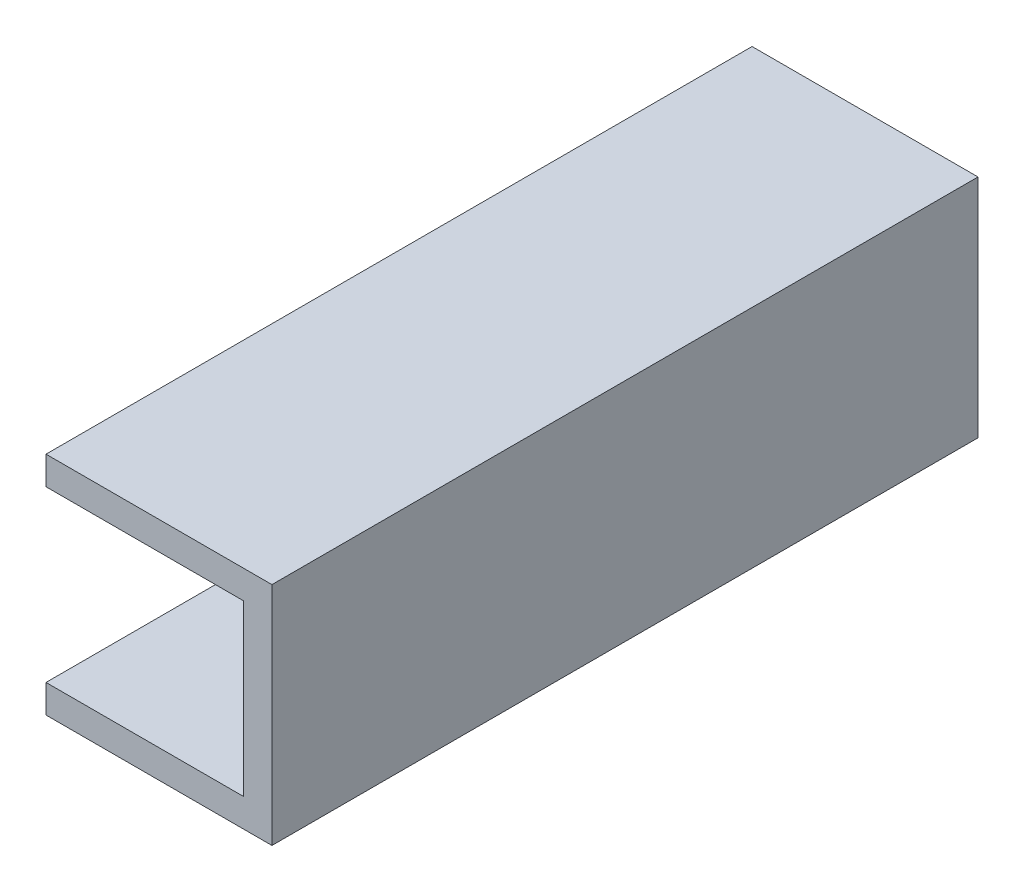
ISO-10303-21;
HEADER;
FILE_DESCRIPTION(('STEP AP214'),'2;1');
FILE_NAME('part.step','',(''),(''),'','','');
FILE_SCHEMA(('AUTOMOTIVE_DESIGN { 1 0 10303 214 1 1 1 1 }'));
ENDSEC;
DATA;
#1=APPLICATION_CONTEXT('core data for automotive mechanical design processes');
#2=APPLICATION_PROTOCOL_DEFINITION('international standard','automotive_design',2000,#1);
#3=PRODUCT_CONTEXT('',#1,'mechanical');
#4=PRODUCT('Part','Part','',(#3));
#5=PRODUCT_RELATED_PRODUCT_CATEGORY('part','',(#4));
#6=PRODUCT_DEFINITION_FORMATION('','',#4);
#7=PRODUCT_DEFINITION_CONTEXT('part definition',#1,'design');
#8=PRODUCT_DEFINITION('design','',#6,#7);
#9=PRODUCT_DEFINITION_SHAPE('','',#8);
#10=(LENGTH_UNIT() NAMED_UNIT(*) SI_UNIT(.MILLI.,.METRE.));
#11=(NAMED_UNIT(*) PLANE_ANGLE_UNIT() SI_UNIT($,.RADIAN.));
#12=(NAMED_UNIT(*) SI_UNIT($,.STERADIAN.) SOLID_ANGLE_UNIT());
#13=UNCERTAINTY_MEASURE_WITH_UNIT(LENGTH_MEASURE(1.E-05),#10,'distance_accuracy_value','');
#14=(GEOMETRIC_REPRESENTATION_CONTEXT(3) GLOBAL_UNCERTAINTY_ASSIGNED_CONTEXT((#13)) GLOBAL_UNIT_ASSIGNED_CONTEXT((#10,
#11,#12)) REPRESENTATION_CONTEXT('',''));
#15=CARTESIAN_POINT('',(0.,0.,0.));
#16=DIRECTION('',(0.,0.,1.));
#17=DIRECTION('',(1.,0.,0.));
#18=AXIS2_PLACEMENT_3D('',#15,#16,#17);
#19=CARTESIAN_POINT('',(0.8,0.2,-0.625));
#20=DIRECTION('',(0.,1.,0.));
#21=DIRECTION('',(-1.,0.,0.));
#22=AXIS2_PLACEMENT_3D('',#19,#20,#21);
#23=PLANE('',#22);
#24=DIRECTION('',(1.,0.,0.));
#25=VECTOR('',#24,1.);
#26=CARTESIAN_POINT('',(0.838043478261,0.2,0.625));
#27=LINE('',#26,#25);
#28=CARTESIAN_POINT('',(1.,0.2,0.625));
#29=VERTEX_POINT('',#28);
#30=CARTESIAN_POINT('',(0.6,0.2,0.625));
#31=VERTEX_POINT('',#30);
#32=EDGE_CURVE('E121',#29,#31,#27,.F.);
#33=ORIENTED_EDGE('',*,*,#32,.F.);
#34=DIRECTION('',(0.,0.,-1.));
#35=VECTOR('',#34,1.);
#36=CARTESIAN_POINT('',(1.,0.2,-0.625));
#37=LINE('',#36,#35);
#38=CARTESIAN_POINT('',(1.,0.2,-0.625));
#39=VERTEX_POINT('',#38);
#40=EDGE_CURVE('E129',#39,#29,#37,.F.);
#41=ORIENTED_EDGE('',*,*,#40,.F.);
#42=DIRECTION('',(1.,0.,0.));
#43=VECTOR('',#42,1.);
#44=CARTESIAN_POINT('',(0.838043478261,0.2,-0.625));
#45=LINE('',#44,#43);
#46=CARTESIAN_POINT('',(0.6,0.2,-0.625));
#47=VERTEX_POINT('',#46);
#48=EDGE_CURVE('E134',#39,#47,#45,.F.);
#49=ORIENTED_EDGE('',*,*,#48,.T.);
#50=DIRECTION('',(0.,0.,1.));
#51=VECTOR('',#50,1.);
#52=CARTESIAN_POINT('',(0.6,0.2,-0.625));
#53=LINE('',#52,#51);
#54=EDGE_CURVE('E20',#31,#47,#53,.F.);
#55=ORIENTED_EDGE('',*,*,#54,.F.);
#56=EDGE_LOOP('',(#33,#41,#49,#55));
#57=FACE_BOUND('',#56,.T.);
#58=ADVANCED_FACE('F17',(#57),#23,.T.);
#59=CARTESIAN_POINT('',(0.6,0.175,-0.625));
#60=DIRECTION('',(-1.,0.,0.));
#61=DIRECTION('',(0.,0.,1.));
#62=AXIS2_PLACEMENT_3D('',#59,#60,#61);
#63=PLANE('',#62);
#64=DIRECTION('',(0.,1.,0.));
#65=VECTOR('',#64,1.);
#66=CARTESIAN_POINT('',(0.6,0.,0.625));
#67=LINE('',#66,#65);
#68=CARTESIAN_POINT('',(0.6,0.15,0.625));
#69=VERTEX_POINT('',#68);
#70=EDGE_CURVE('E119',#31,#69,#67,.F.);
#71=ORIENTED_EDGE('',*,*,#70,.F.);
#72=ORIENTED_EDGE('',*,*,#54,.T.);
#73=DIRECTION('',(0.,1.,0.));
#74=VECTOR('',#73,1.);
#75=CARTESIAN_POINT('',(0.6,0.,-0.625));
#76=LINE('',#75,#74);
#77=CARTESIAN_POINT('',(0.6,0.15,-0.625));
#78=VERTEX_POINT('',#77);
#79=EDGE_CURVE('E81',#47,#78,#76,.F.);
#80=ORIENTED_EDGE('',*,*,#79,.T.);
#81=DIRECTION('',(0.,0.,1.));
#82=VECTOR('',#81,1.);
#83=CARTESIAN_POINT('',(0.6,0.15,-0.625));
#84=LINE('',#83,#82);
#85=EDGE_CURVE('E84',#69,#78,#84,.F.);
#86=ORIENTED_EDGE('',*,*,#85,.F.);
#87=EDGE_LOOP('',(#71,#72,#80,#86));
#88=FACE_BOUND('',#87,.T.);
#89=ADVANCED_FACE('F83',(#88),#63,.T.);
#90=CARTESIAN_POINT('',(0.775,0.15,-0.625));
#91=DIRECTION('',(0.,-1.,0.));
#92=DIRECTION('',(1.,0.,0.));
#93=AXIS2_PLACEMENT_3D('',#90,#91,#92);
#94=PLANE('',#93);
#95=DIRECTION('',(1.,0.,0.));
#96=VECTOR('',#95,1.);
#97=CARTESIAN_POINT('',(0.838043478261,0.15,0.625));
#98=LINE('',#97,#96);
#99=CARTESIAN_POINT('',(0.95,0.15,0.625));
#100=VERTEX_POINT('',#99);
#101=EDGE_CURVE('E95',#69,#100,#98,.T.);
#102=ORIENTED_EDGE('',*,*,#101,.F.);
#103=ORIENTED_EDGE('',*,*,#85,.T.);
#104=DIRECTION('',(1.,0.,0.));
#105=VECTOR('',#104,1.);
#106=CARTESIAN_POINT('',(0.838043478261,0.15,-0.625));
#107=LINE('',#106,#105);
#108=CARTESIAN_POINT('',(0.95,0.15,-0.625));
#109=VERTEX_POINT('',#108);
#110=EDGE_CURVE('E88',#78,#109,#107,.T.);
#111=ORIENTED_EDGE('',*,*,#110,.T.);
#112=DIRECTION('',(0.,0.,1.));
#113=VECTOR('',#112,1.);
#114=CARTESIAN_POINT('',(0.95,0.15,-0.625));
#115=LINE('',#114,#113);
#116=EDGE_CURVE('E97',#100,#109,#115,.F.);
#117=ORIENTED_EDGE('',*,*,#116,.F.);
#118=EDGE_LOOP('',(#102,#103,#111,#117));
#119=FACE_BOUND('',#118,.T.);
#120=ADVANCED_FACE('F92',(#119),#94,.T.);
#121=CARTESIAN_POINT('',(0.95,0.,-0.625));
#122=DIRECTION('',(-1.,0.,0.));
#123=DIRECTION('',(0.,0.,1.));
#124=AXIS2_PLACEMENT_3D('',#121,#122,#123);
#125=PLANE('',#124);
#126=DIRECTION('',(0.,1.,0.));
#127=VECTOR('',#126,1.);
#128=CARTESIAN_POINT('',(0.95,0.,0.625));
#129=LINE('',#128,#127);
#130=CARTESIAN_POINT('',(0.95,-0.15,0.625));
#131=VERTEX_POINT('',#130);
#132=EDGE_CURVE('E113',#100,#131,#129,.F.);
#133=ORIENTED_EDGE('',*,*,#132,.F.);
#134=ORIENTED_EDGE('',*,*,#116,.T.);
#135=DIRECTION('',(0.,1.,0.));
#136=VECTOR('',#135,1.);
#137=CARTESIAN_POINT('',(0.95,0.,-0.625));
#138=LINE('',#137,#136);
#139=CARTESIAN_POINT('',(0.95,-0.15,-0.625));
#140=VERTEX_POINT('',#139);
#141=EDGE_CURVE('E101',#109,#140,#138,.F.);
#142=ORIENTED_EDGE('',*,*,#141,.T.);
#143=DIRECTION('',(0.,0.,1.));
#144=VECTOR('',#143,1.);
#145=CARTESIAN_POINT('',(0.95,-0.15,-0.625));
#146=LINE('',#145,#144);
#147=EDGE_CURVE('E89',#131,#140,#146,.F.);
#148=ORIENTED_EDGE('',*,*,#147,.F.);
#149=EDGE_LOOP('',(#133,#134,#142,#148));
#150=FACE_BOUND('',#149,.T.);
#151=ADVANCED_FACE('F111',(#150),#125,.T.);
#152=CARTESIAN_POINT('',(0.775,-0.15,-0.625));
#153=DIRECTION('',(0.,1.,0.));
#154=DIRECTION('',(-1.,0.,0.));
#155=AXIS2_PLACEMENT_3D('',#152,#153,#154);
#156=PLANE('',#155);
#157=DIRECTION('',(1.,0.,0.));
#158=VECTOR('',#157,1.);
#159=CARTESIAN_POINT('',(0.838043478261,-0.15,0.625));
#160=LINE('',#159,#158);
#161=CARTESIAN_POINT('',(0.6,-0.15,0.625));
#162=VERTEX_POINT('',#161);
#163=EDGE_CURVE('E115',#131,#162,#160,.F.);
#164=ORIENTED_EDGE('',*,*,#163,.F.);
#165=ORIENTED_EDGE('',*,*,#147,.T.);
#166=DIRECTION('',(1.,0.,0.));
#167=VECTOR('',#166,1.);
#168=CARTESIAN_POINT('',(0.838043478261,-0.15,-0.625));
#169=LINE('',#168,#167);
#170=CARTESIAN_POINT('',(0.6,-0.15,-0.625));
#171=VERTEX_POINT('',#170);
#172=EDGE_CURVE('E103',#140,#171,#169,.F.);
#173=ORIENTED_EDGE('',*,*,#172,.T.);
#174=DIRECTION('',(0.,0.,1.));
#175=VECTOR('',#174,1.);
#176=CARTESIAN_POINT('',(0.6,-0.15,-0.625));
#177=LINE('',#176,#175);
#178=EDGE_CURVE('E140',#162,#171,#177,.F.);
#179=ORIENTED_EDGE('',*,*,#178,.F.);
#180=EDGE_LOOP('',(#164,#165,#173,#179));
#181=FACE_BOUND('',#180,.T.);
#182=ADVANCED_FACE('F138',(#181),#156,.T.);
#183=CARTESIAN_POINT('',(0.838043478261,0.,-0.625));
#184=DIRECTION('',(0.,0.,1.));
#185=DIRECTION('',(1.,0.,0.));
#186=AXIS2_PLACEMENT_3D('',#183,#184,#185);
#187=PLANE('',#186);
#188=DIRECTION('',(0.,1.,0.));
#189=VECTOR('',#188,1.);
#190=CARTESIAN_POINT('',(1.,0.,-0.625));
#191=LINE('',#190,#189);
#192=CARTESIAN_POINT('',(1.,-0.2,-0.625));
#193=VERTEX_POINT('',#192);
#194=EDGE_CURVE('E131',#193,#39,#191,.T.);
#195=ORIENTED_EDGE('',*,*,#194,.F.);
#196=DIRECTION('',(1.,0.,0.));
#197=VECTOR('',#196,1.);
#198=CARTESIAN_POINT('',(0.8,-0.2,-0.625));
#199=LINE('',#198,#197);
#200=CARTESIAN_POINT('',(0.6,-0.2,-0.625));
#201=VERTEX_POINT('',#200);
#202=EDGE_CURVE('E144',#201,#193,#199,.T.);
#203=ORIENTED_EDGE('',*,*,#202,.F.);
#204=DIRECTION('',(0.,1.,0.));
#205=VECTOR('',#204,1.);
#206=CARTESIAN_POINT('',(0.6,-0.175,-0.625));
#207=LINE('',#206,#205);
#208=EDGE_CURVE('E142',#171,#201,#207,.F.);
#209=ORIENTED_EDGE('',*,*,#208,.F.);
#210=ORIENTED_EDGE('',*,*,#172,.F.);
#211=ORIENTED_EDGE('',*,*,#141,.F.);
#212=ORIENTED_EDGE('',*,*,#110,.F.);
#213=ORIENTED_EDGE('',*,*,#79,.F.);
#214=ORIENTED_EDGE('',*,*,#48,.F.);
#215=EDGE_LOOP('',(#195,#203,#209,#210,#211,#212,#213,#214));
#216=FACE_BOUND('',#215,.T.);
#217=ADVANCED_FACE('F99',(#216),#187,.F.);
#218=CARTESIAN_POINT('',(1.,0.,-0.625));
#219=DIRECTION('',(1.,0.,0.));
#220=DIRECTION('',(0.,0.,-1.));
#221=AXIS2_PLACEMENT_3D('',#218,#219,#220);
#222=PLANE('',#221);
#223=DIRECTION('',(0.,1.,0.));
#224=VECTOR('',#223,1.);
#225=CARTESIAN_POINT('',(1.,0.,0.625));
#226=LINE('',#225,#224);
#227=CARTESIAN_POINT('',(1.,-0.2,0.625));
#228=VERTEX_POINT('',#227);
#229=EDGE_CURVE('E126',#228,#29,#226,.T.);
#230=ORIENTED_EDGE('',*,*,#229,.F.);
#231=DIRECTION('',(0.,0.,1.));
#232=VECTOR('',#231,1.);
#233=CARTESIAN_POINT('',(1.,-0.2,-0.625));
#234=LINE('',#233,#232);
#235=EDGE_CURVE('E149',#193,#228,#234,.T.);
#236=ORIENTED_EDGE('',*,*,#235,.F.);
#237=ORIENTED_EDGE('',*,*,#194,.T.);
#238=ORIENTED_EDGE('',*,*,#40,.T.);
#239=EDGE_LOOP('',(#230,#236,#237,#238));
#240=FACE_BOUND('',#239,.T.);
#241=ADVANCED_FACE('F161',(#240),#222,.T.);
#242=CARTESIAN_POINT('',(0.838043478261,0.,0.625));
#243=DIRECTION('',(0.,0.,1.));
#244=DIRECTION('',(1.,0.,0.));
#245=AXIS2_PLACEMENT_3D('',#242,#243,#244);
#246=PLANE('',#245);
#247=ORIENTED_EDGE('',*,*,#163,.T.);
#248=DIRECTION('',(0.,1.,0.));
#249=VECTOR('',#248,1.);
#250=CARTESIAN_POINT('',(0.6,-0.175,0.625));
#251=LINE('',#250,#249);
#252=CARTESIAN_POINT('',(0.6,-0.2,0.625));
#253=VERTEX_POINT('',#252);
#254=EDGE_CURVE('E35',#253,#162,#251,.T.);
#255=ORIENTED_EDGE('',*,*,#254,.F.);
#256=DIRECTION('',(1.,0.,0.));
#257=VECTOR('',#256,1.);
#258=CARTESIAN_POINT('',(0.8,-0.2,0.625));
#259=LINE('',#258,#257);
#260=EDGE_CURVE('E26',#228,#253,#259,.F.);
#261=ORIENTED_EDGE('',*,*,#260,.F.);
#262=ORIENTED_EDGE('',*,*,#229,.T.);
#263=ORIENTED_EDGE('',*,*,#32,.T.);
#264=ORIENTED_EDGE('',*,*,#70,.T.);
#265=ORIENTED_EDGE('',*,*,#101,.T.);
#266=ORIENTED_EDGE('',*,*,#132,.T.);
#267=EDGE_LOOP('',(#247,#255,#261,#262,#263,#264,#265,#266));
#268=FACE_BOUND('',#267,.T.);
#269=ADVANCED_FACE('F117',(#268),#246,.T.);
#270=CARTESIAN_POINT('',(0.6,-0.175,-0.625));
#271=DIRECTION('',(-1.,0.,0.));
#272=DIRECTION('',(0.,0.,1.));
#273=AXIS2_PLACEMENT_3D('',#270,#271,#272);
#274=PLANE('',#273);
#275=ORIENTED_EDGE('',*,*,#254,.T.);
#276=ORIENTED_EDGE('',*,*,#178,.T.);
#277=ORIENTED_EDGE('',*,*,#208,.T.);
#278=DIRECTION('',(0.,0.,1.));
#279=VECTOR('',#278,1.);
#280=CARTESIAN_POINT('',(0.6,-0.2,-0.625));
#281=LINE('',#280,#279);
#282=EDGE_CURVE('E11',#253,#201,#281,.F.);
#283=ORIENTED_EDGE('',*,*,#282,.F.);
#284=EDGE_LOOP('',(#275,#276,#277,#283));
#285=FACE_BOUND('',#284,.T.);
#286=ADVANCED_FACE('F147',(#285),#274,.T.);
#287=CARTESIAN_POINT('',(0.8,-0.2,-0.625));
#288=DIRECTION('',(0.,-1.,0.));
#289=DIRECTION('',(1.,0.,0.));
#290=AXIS2_PLACEMENT_3D('',#287,#288,#289);
#291=PLANE('',#290);
#292=ORIENTED_EDGE('',*,*,#260,.T.);
#293=ORIENTED_EDGE('',*,*,#282,.T.);
#294=ORIENTED_EDGE('',*,*,#202,.T.);
#295=ORIENTED_EDGE('',*,*,#235,.T.);
#296=EDGE_LOOP('',(#292,#293,#294,#295));
#297=FACE_BOUND('',#296,.T.);
#298=ADVANCED_FACE('F157',(#297),#291,.T.);
#299=CLOSED_SHELL('',(#58,#89,#120,#151,#182,#217,#241,#269,#286,#298));
#300=MANIFOLD_SOLID_BREP('B1',#299);
#301=ADVANCED_BREP_SHAPE_REPRESENTATION('',(#18,#300),#14);
#302=SHAPE_DEFINITION_REPRESENTATION(#9,#301);
ENDSEC;
END-ISO-10303-21;
